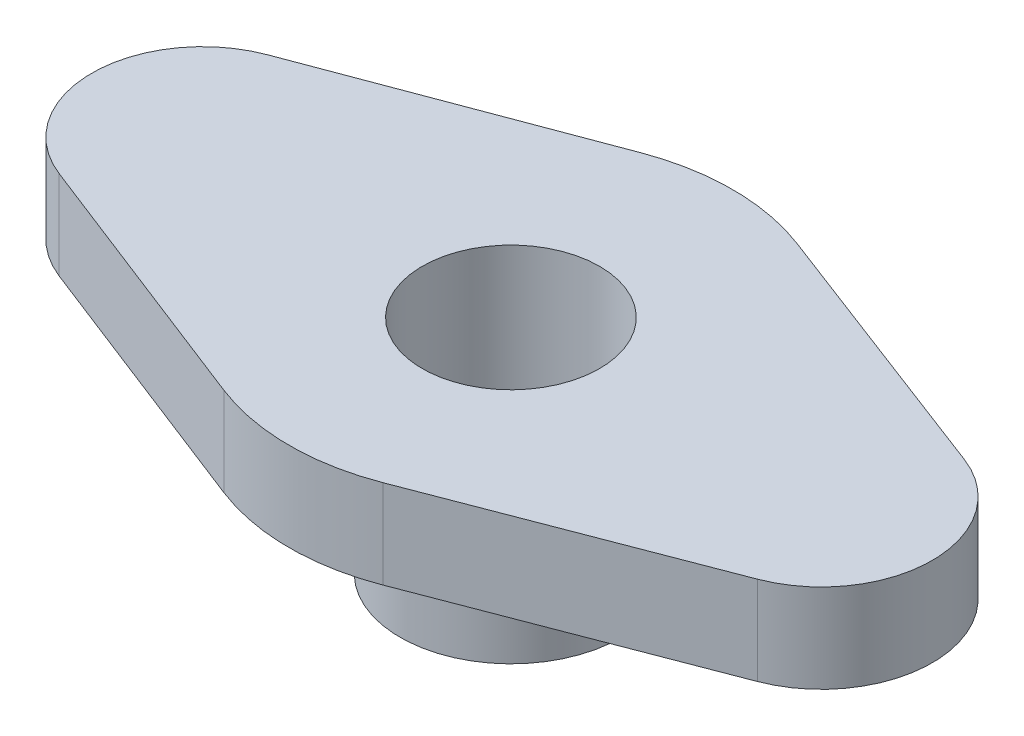
ISO-10303-21;
HEADER;
FILE_DESCRIPTION(('STEP AP214'),'2;1');
FILE_NAME('part.step','',(''),(''),'','','');
FILE_SCHEMA(('AUTOMOTIVE_DESIGN { 1 0 10303 214 1 1 1 1 }'));
ENDSEC;
DATA;
#1=APPLICATION_CONTEXT('core data for automotive mechanical design processes');
#2=APPLICATION_PROTOCOL_DEFINITION('international standard','automotive_design',2000,#1);
#3=PRODUCT_CONTEXT('',#1,'mechanical');
#4=PRODUCT('Part','Part','',(#3));
#5=PRODUCT_RELATED_PRODUCT_CATEGORY('part','',(#4));
#6=PRODUCT_DEFINITION_FORMATION('','',#4);
#7=PRODUCT_DEFINITION_CONTEXT('part definition',#1,'design');
#8=PRODUCT_DEFINITION('design','',#6,#7);
#9=PRODUCT_DEFINITION_SHAPE('','',#8);
#10=(LENGTH_UNIT() NAMED_UNIT(*) SI_UNIT(.MILLI.,.METRE.));
#11=(NAMED_UNIT(*) PLANE_ANGLE_UNIT() SI_UNIT($,.RADIAN.));
#12=(NAMED_UNIT(*) SI_UNIT($,.STERADIAN.) SOLID_ANGLE_UNIT());
#13=UNCERTAINTY_MEASURE_WITH_UNIT(LENGTH_MEASURE(1.E-05),#10,'distance_accuracy_value','');
#14=(GEOMETRIC_REPRESENTATION_CONTEXT(3) GLOBAL_UNCERTAINTY_ASSIGNED_CONTEXT((#13)) GLOBAL_UNIT_ASSIGNED_CONTEXT((#10,
#11,#12)) REPRESENTATION_CONTEXT('',''));
#15=CARTESIAN_POINT('',(0.,0.,0.));
#16=DIRECTION('',(0.,0.,1.));
#17=DIRECTION('',(1.,0.,0.));
#18=AXIS2_PLACEMENT_3D('',#15,#16,#17);
#19=CARTESIAN_POINT('',(69.9999921528156,-20.,-0.0331452222624423));
#20=DIRECTION('',(0.,1.,0.));
#21=DIRECTION('',(0.,0.,1.));
#22=AXIS2_PLACEMENT_3D('',#19,#20,#21);
#23=CYLINDRICAL_SURFACE('',#22,25.);
#24=CARTESIAN_POINT('',(69.9999921528156,0.,-0.0331452222624423));
#25=DIRECTION('',(0.,-1.,0.));
#26=DIRECTION('',(0.,0.,-1.));
#27=AXIS2_PLACEMENT_3D('',#24,#25,#26);
#28=CIRCLE('',#27,25.);
#29=CARTESIAN_POINT('',(78.9175056921311,0.,-23.3886146518441));
#30=VERTEX_POINT('',#29);
#31=CARTESIAN_POINT('',(78.9396194688102,0.,23.3138687934768));
#32=VERTEX_POINT('',#31);
#33=EDGE_CURVE('E135',#30,#32,#28,.T.);
#34=ORIENTED_EDGE('',*,*,#33,.T.);
#35=DIRECTION('',(0.,1.,0.));
#36=VECTOR('',#35,1.);
#37=CARTESIAN_POINT('',(78.9396194688102,-20.,23.3138687934768));
#38=LINE('',#37,#36);
#39=CARTESIAN_POINT('',(78.9396194688102,-20.,23.3138687934768));
#40=VERTEX_POINT('',#39);
#41=EDGE_CURVE('E40',#40,#32,#38,.T.);
#42=ORIENTED_EDGE('',*,*,#41,.F.);
#43=CARTESIAN_POINT('',(69.9999921528156,-20.,-0.0331452222624423));
#44=DIRECTION('',(0.,-1.,0.));
#45=DIRECTION('',(0.,0.,-1.));
#46=AXIS2_PLACEMENT_3D('',#43,#44,#45);
#47=CIRCLE('',#46,25.);
#48=CARTESIAN_POINT('',(78.9175056921311,-20.,-23.3886146518441));
#49=VERTEX_POINT('',#48);
#50=EDGE_CURVE('E150',#49,#40,#47,.T.);
#51=ORIENTED_EDGE('',*,*,#50,.F.);
#52=DIRECTION('',(0.,1.,0.));
#53=VECTOR('',#52,1.);
#54=CARTESIAN_POINT('',(78.9175056921311,-20.,-23.3886146518441));
#55=LINE('',#54,#53);
#56=EDGE_CURVE('E131',#49,#30,#55,.T.);
#57=ORIENTED_EDGE('',*,*,#56,.T.);
#58=EDGE_LOOP('',(#34,#42,#51,#57));
#59=FACE_BOUND('',#58,.T.);
#60=ADVANCED_FACE('F37',(#59),#23,.T.);
#61=CARTESIAN_POINT('',(17.8792546319892,-20.,46.6940280314785));
#62=DIRECTION('',(-0.357585092639783,0.,-0.933880560629569));
#63=DIRECTION('',(-0.933880560629569,0.,0.357585092639783));
#64=AXIS2_PLACEMENT_3D('',#61,#62,#63);
#65=PLANE('',#64);
#66=DIRECTION('',(-0.933880560629569,0.,0.357585092639783));
#67=VECTOR('',#66,1.);
#68=CARTESIAN_POINT('',(17.8792546319892,0.,46.6940280314785));
#69=LINE('',#68,#67);
#70=CARTESIAN_POINT('',(17.8792546319892,0.,46.6940280314785));
#71=VERTEX_POINT('',#70);
#72=EDGE_CURVE('E138',#32,#71,#69,.T.);
#73=ORIENTED_EDGE('',*,*,#72,.T.);
#74=DIRECTION('',(0.,1.,0.));
#75=VECTOR('',#74,1.);
#76=CARTESIAN_POINT('',(17.8792546319892,-20.,46.6940280314785));
#77=LINE('',#76,#75);
#78=CARTESIAN_POINT('',(17.8792546319892,-20.,46.6940280314785));
#79=VERTEX_POINT('',#78);
#80=EDGE_CURVE('E159',#79,#71,#77,.T.);
#81=ORIENTED_EDGE('',*,*,#80,.F.);
#82=DIRECTION('',(-0.933880560629569,0.,0.357585092639783));
#83=VECTOR('',#82,1.);
#84=CARTESIAN_POINT('',(17.8792546319892,-20.,46.6940280314785));
#85=LINE('',#84,#83);
#86=EDGE_CURVE('E98',#40,#79,#85,.T.);
#87=ORIENTED_EDGE('',*,*,#86,.F.);
#88=ORIENTED_EDGE('',*,*,#41,.T.);
#89=EDGE_LOOP('',(#73,#81,#87,#88));
#90=FACE_BOUND('',#89,.T.);
#91=ADVANCED_FACE('F165',(#90),#65,.F.);
#92=CARTESIAN_POINT('',(0.,-20.,0.));
#93=DIRECTION('',(0.,1.,0.));
#94=DIRECTION('',(0.,0.,1.));
#95=AXIS2_PLACEMENT_3D('',#92,#93,#94);
#96=CYLINDRICAL_SURFACE('',#95,50.);
#97=CARTESIAN_POINT('',(0.,0.,0.));
#98=DIRECTION('',(0.,-1.,0.));
#99=DIRECTION('',(0.,0.,-1.));
#100=AXIS2_PLACEMENT_3D('',#97,#98,#99);
#101=CIRCLE('',#100,50.);
#102=CARTESIAN_POINT('',(-18.1568826975564,0.,46.5867750623198));
#103=VERTEX_POINT('',#102);
#104=EDGE_CURVE('E141',#71,#103,#101,.T.);
#105=ORIENTED_EDGE('',*,*,#104,.T.);
#106=DIRECTION('',(0.,1.,0.));
#107=VECTOR('',#106,1.);
#108=CARTESIAN_POINT('',(-18.1568826975564,-20.,46.5867750623198));
#109=LINE('',#108,#107);
#110=CARTESIAN_POINT('',(-18.1568826975564,-20.,46.5867750623198));
#111=VERTEX_POINT('',#110);
#112=EDGE_CURVE('E157',#111,#103,#109,.T.);
#113=ORIENTED_EDGE('',*,*,#112,.F.);
#114=CARTESIAN_POINT('',(0.,-20.,0.));
#115=DIRECTION('',(0.,-1.,0.));
#116=DIRECTION('',(0.,0.,-1.));
#117=AXIS2_PLACEMENT_3D('',#114,#115,#116);
#118=CIRCLE('',#117,50.);
#119=EDGE_CURVE('E180',#79,#111,#118,.T.);
#120=ORIENTED_EDGE('',*,*,#119,.F.);
#121=ORIENTED_EDGE('',*,*,#80,.T.);
#122=EDGE_LOOP('',(#105,#113,#120,#121));
#123=FACE_BOUND('',#122,.T.);
#124=ADVANCED_FACE('F174',(#123),#96,.T.);
#125=CARTESIAN_POINT('',(-79.0769960781902,-20.,22.8435700198086));
#126=DIRECTION('',(0.363137653951129,0.,-0.931735501246395));
#127=DIRECTION('',(-0.931735501246395,0.,-0.363137653951129));
#128=AXIS2_PLACEMENT_3D('',#125,#126,#127);
#129=PLANE('',#128);
#130=DIRECTION('',(-0.931735501246395,0.,-0.363137653951129));
#131=VECTOR('',#130,1.);
#132=CARTESIAN_POINT('',(-79.0769960781902,0.,22.8435700198086));
#133=LINE('',#132,#131);
#134=CARTESIAN_POINT('',(-79.0769960781902,0.,22.8435700198086));
#135=VERTEX_POINT('',#134);
#136=EDGE_CURVE('E143',#103,#135,#133,.T.);
#137=ORIENTED_EDGE('',*,*,#136,.T.);
#138=DIRECTION('',(0.,1.,0.));
#139=VECTOR('',#138,1.);
#140=CARTESIAN_POINT('',(-79.0769960781902,-20.,22.8435700198086));
#141=LINE('',#140,#139);
#142=CARTESIAN_POINT('',(-79.0769960781902,-20.,22.8435700198086));
#143=VERTEX_POINT('',#142);
#144=EDGE_CURVE('E154',#143,#135,#141,.T.);
#145=ORIENTED_EDGE('',*,*,#144,.F.);
#146=DIRECTION('',(-0.931735501246395,0.,-0.363137653951129));
#147=VECTOR('',#146,1.);
#148=CARTESIAN_POINT('',(-79.0769960781902,-20.,22.8435700198086));
#149=LINE('',#148,#147);
#150=EDGE_CURVE('E179',#111,#143,#149,.T.);
#151=ORIENTED_EDGE('',*,*,#150,.F.);
#152=ORIENTED_EDGE('',*,*,#112,.T.);
#153=EDGE_LOOP('',(#137,#145,#151,#152));
#154=FACE_BOUND('',#153,.T.);
#155=ADVANCED_FACE('F177',(#154),#129,.F.);
#156=CARTESIAN_POINT('',(-69.998554729412,-20.,-0.449817511351326));
#157=DIRECTION('',(0.,1.,0.));
#158=DIRECTION('',(0.,0.,1.));
#159=AXIS2_PLACEMENT_3D('',#156,#157,#158);
#160=CYLINDRICAL_SURFACE('',#159,25.);
#161=CARTESIAN_POINT('',(-69.998554729412,0.,-0.449817511351326));
#162=DIRECTION('',(0.,-1.,0.));
#163=DIRECTION('',(0.,0.,-1.));
#164=AXIS2_PLACEMENT_3D('',#161,#162,#163);
#165=CIRCLE('',#164,25.);
#166=CARTESIAN_POINT('',(-78.7768875463001,0.,-23.8579544076518));
#167=VERTEX_POINT('',#166);
#168=EDGE_CURVE('E145',#135,#167,#165,.T.);
#169=ORIENTED_EDGE('',*,*,#168,.T.);
#170=DIRECTION('',(0.,1.,0.));
#171=VECTOR('',#170,1.);
#172=CARTESIAN_POINT('',(-78.7768875463001,-20.,-23.8579544076518));
#173=LINE('',#172,#171);
#174=CARTESIAN_POINT('',(-78.7768875463001,-20.,-23.8579544076518));
#175=VERTEX_POINT('',#174);
#176=EDGE_CURVE('E126',#175,#167,#173,.T.);
#177=ORIENTED_EDGE('',*,*,#176,.F.);
#178=CARTESIAN_POINT('',(-69.998554729412,-20.,-0.449817511351326));
#179=DIRECTION('',(0.,-1.,0.));
#180=DIRECTION('',(0.,0.,-1.));
#181=AXIS2_PLACEMENT_3D('',#178,#179,#180);
#182=CIRCLE('',#181,25.);
#183=EDGE_CURVE('E117',#143,#175,#182,.T.);
#184=ORIENTED_EDGE('',*,*,#183,.F.);
#185=ORIENTED_EDGE('',*,*,#144,.T.);
#186=EDGE_LOOP('',(#169,#177,#184,#185));
#187=FACE_BOUND('',#186,.T.);
#188=ADVANCED_FACE('F234',(#187),#160,.T.);
#189=CARTESIAN_POINT('',(-17.5566656337762,-20.,-46.816273792601));
#190=DIRECTION('',(0.351133312675524,0.,0.93632547585202));
#191=DIRECTION('',(0.93632547585202,0.,-0.351133312675524));
#192=AXIS2_PLACEMENT_3D('',#189,#190,#191);
#193=PLANE('',#192);
#194=DIRECTION('',(0.93632547585202,0.,-0.351133312675524));
#195=VECTOR('',#194,1.);
#196=CARTESIAN_POINT('',(-17.5566656337762,0.,-46.816273792601));
#197=LINE('',#196,#195);
#198=CARTESIAN_POINT('',(-17.5566656337762,0.,-46.816273792601));
#199=VERTEX_POINT('',#198);
#200=EDGE_CURVE('E125',#167,#199,#197,.T.);
#201=ORIENTED_EDGE('',*,*,#200,.T.);
#202=DIRECTION('',(0.,1.,0.));
#203=VECTOR('',#202,1.);
#204=CARTESIAN_POINT('',(-17.5566656337762,-20.,-46.816273792601));
#205=LINE('',#204,#203);
#206=CARTESIAN_POINT('',(-17.5566656337762,-20.,-46.816273792601));
#207=VERTEX_POINT('',#206);
#208=EDGE_CURVE('E122',#207,#199,#205,.T.);
#209=ORIENTED_EDGE('',*,*,#208,.F.);
#210=DIRECTION('',(0.93632547585202,0.,-0.351133312675524));
#211=VECTOR('',#210,1.);
#212=CARTESIAN_POINT('',(-17.5566656337762,-20.,-46.816273792601));
#213=LINE('',#212,#211);
#214=EDGE_CURVE('E111',#175,#207,#213,.T.);
#215=ORIENTED_EDGE('',*,*,#214,.F.);
#216=ORIENTED_EDGE('',*,*,#176,.T.);
#217=EDGE_LOOP('',(#201,#209,#215,#216));
#218=FACE_BOUND('',#217,.T.);
#219=ADVANCED_FACE('F123',(#218),#193,.F.);
#220=CARTESIAN_POINT('',(0.,-20.,0.));
#221=DIRECTION('',(0.,1.,0.));
#222=DIRECTION('',(0.,0.,1.));
#223=AXIS2_PLACEMENT_3D('',#220,#221,#222);
#224=CYLINDRICAL_SURFACE('',#223,50.);
#225=CARTESIAN_POINT('',(0.,0.,0.));
#226=DIRECTION('',(0.,-1.,0.));
#227=DIRECTION('',(0.,0.,-1.));
#228=AXIS2_PLACEMENT_3D('',#225,#226,#227);
#229=CIRCLE('',#228,50.);
#230=CARTESIAN_POINT('',(17.835027078631,0.,-46.7109388591634));
#231=VERTEX_POINT('',#230);
#232=EDGE_CURVE('E83',#199,#231,#229,.T.);
#233=ORIENTED_EDGE('',*,*,#232,.T.);
#234=DIRECTION('',(0.,1.,0.));
#235=VECTOR('',#234,1.);
#236=CARTESIAN_POINT('',(17.835027078631,-20.,-46.7109388591634));
#237=LINE('',#236,#235);
#238=CARTESIAN_POINT('',(17.835027078631,-20.,-46.7109388591634));
#239=VERTEX_POINT('',#238);
#240=EDGE_CURVE('E127',#239,#231,#237,.T.);
#241=ORIENTED_EDGE('',*,*,#240,.F.);
#242=CARTESIAN_POINT('',(0.,-20.,0.));
#243=DIRECTION('',(0.,-1.,0.));
#244=DIRECTION('',(0.,0.,-1.));
#245=AXIS2_PLACEMENT_3D('',#242,#243,#244);
#246=CIRCLE('',#245,50.);
#247=EDGE_CURVE('E115',#207,#239,#246,.T.);
#248=ORIENTED_EDGE('',*,*,#247,.F.);
#249=ORIENTED_EDGE('',*,*,#208,.T.);
#250=EDGE_LOOP('',(#233,#241,#248,#249));
#251=FACE_BOUND('',#250,.T.);
#252=ADVANCED_FACE('F129',(#251),#224,.T.);
#253=CARTESIAN_POINT('',(78.9175056921311,-20.,-23.3886146518441));
#254=DIRECTION('',(-0.35670054157262,0.,0.934218777183267));
#255=DIRECTION('',(0.934218777183267,0.,0.35670054157262));
#256=AXIS2_PLACEMENT_3D('',#253,#254,#255);
#257=PLANE('',#256);
#258=DIRECTION('',(0.934218777183267,0.,0.35670054157262));
#259=VECTOR('',#258,1.);
#260=CARTESIAN_POINT('',(78.9175056921311,0.,-23.3886146518441));
#261=LINE('',#260,#259);
#262=EDGE_CURVE('E89',#231,#30,#261,.T.);
#263=ORIENTED_EDGE('',*,*,#262,.T.);
#264=ORIENTED_EDGE('',*,*,#56,.F.);
#265=DIRECTION('',(0.934218777183267,0.,0.35670054157262));
#266=VECTOR('',#265,1.);
#267=CARTESIAN_POINT('',(78.9175056921311,-20.,-23.3886146518441));
#268=LINE('',#267,#266);
#269=EDGE_CURVE('E54',#239,#49,#268,.T.);
#270=ORIENTED_EDGE('',*,*,#269,.F.);
#271=ORIENTED_EDGE('',*,*,#240,.T.);
#272=EDGE_LOOP('',(#263,#264,#270,#271));
#273=FACE_BOUND('',#272,.T.);
#274=ADVANCED_FACE('F215',(#273),#257,.F.);
#275=CARTESIAN_POINT('',(69.9999921528156,-20.,-0.0331452222624423));
#276=DIRECTION('',(0.,-1.,0.));
#277=DIRECTION('',(0.,0.,-1.));
#278=AXIS2_PLACEMENT_3D('',#275,#276,#277);
#279=PLANE('',#278);
#280=CARTESIAN_POINT('',(0.,-20.,0.));
#281=DIRECTION('',(0.,-1.,0.));
#282=DIRECTION('',(0.,0.,-1.));
#283=AXIS2_PLACEMENT_3D('',#280,#281,#282);
#284=CIRCLE('',#283,25.);
#285=CARTESIAN_POINT('',(0.,-20.,-25.));
#286=VERTEX_POINT('',#285);
#287=EDGE_CURVE('E11',#286,#286,#284,.T.);
#288=ORIENTED_EDGE('',*,*,#287,.F.);
#289=EDGE_LOOP('',(#288));
#290=FACE_BOUND('',#289,.T.);
#291=ORIENTED_EDGE('',*,*,#50,.T.);
#292=ORIENTED_EDGE('',*,*,#86,.T.);
#293=ORIENTED_EDGE('',*,*,#119,.T.);
#294=ORIENTED_EDGE('',*,*,#150,.T.);
#295=ORIENTED_EDGE('',*,*,#183,.T.);
#296=ORIENTED_EDGE('',*,*,#214,.T.);
#297=ORIENTED_EDGE('',*,*,#247,.T.);
#298=ORIENTED_EDGE('',*,*,#269,.T.);
#299=EDGE_LOOP('',(#291,#292,#293,#294,#295,#296,#297,#298));
#300=FACE_BOUND('',#299,.T.);
#301=ADVANCED_FACE('F113',(#290,#300),#279,.T.);
#302=CARTESIAN_POINT('',(69.9999921528156,0.,-0.0331452222624423));
#303=DIRECTION('',(0.,-1.,0.));
#304=DIRECTION('',(0.,0.,-1.));
#305=AXIS2_PLACEMENT_3D('',#302,#303,#304);
#306=PLANE('',#305);
#307=CARTESIAN_POINT('',(0.,0.,0.));
#308=DIRECTION('',(0.,-1.,0.));
#309=DIRECTION('',(0.,0.,-1.));
#310=AXIS2_PLACEMENT_3D('',#307,#308,#309);
#311=CIRCLE('',#310,20.);
#312=CARTESIAN_POINT('',(0.,0.,-20.));
#313=VERTEX_POINT('',#312);
#314=EDGE_CURVE('E188',#313,#313,#311,.T.);
#315=ORIENTED_EDGE('',*,*,#314,.T.);
#316=EDGE_LOOP('',(#315));
#317=FACE_BOUND('',#316,.T.);
#318=ORIENTED_EDGE('',*,*,#33,.F.);
#319=ORIENTED_EDGE('',*,*,#262,.F.);
#320=ORIENTED_EDGE('',*,*,#232,.F.);
#321=ORIENTED_EDGE('',*,*,#200,.F.);
#322=ORIENTED_EDGE('',*,*,#168,.F.);
#323=ORIENTED_EDGE('',*,*,#136,.F.);
#324=ORIENTED_EDGE('',*,*,#104,.F.);
#325=ORIENTED_EDGE('',*,*,#72,.F.);
#326=EDGE_LOOP('',(#318,#319,#320,#321,#322,#323,#324,#325));
#327=FACE_BOUND('',#326,.T.);
#328=ADVANCED_FACE('F170',(#317,#327),#306,.F.);
#329=CARTESIAN_POINT('',(0.,-50.,0.));
#330=DIRECTION('',(0.,1.,0.));
#331=DIRECTION('',(0.,0.,1.));
#332=AXIS2_PLACEMENT_3D('',#329,#330,#331);
#333=CYLINDRICAL_SURFACE('',#332,25.);
#334=CARTESIAN_POINT('',(0.,-50.,0.));
#335=DIRECTION('',(0.,-1.,0.));
#336=DIRECTION('',(0.,0.,-1.));
#337=AXIS2_PLACEMENT_3D('',#334,#335,#336);
#338=CIRCLE('',#337,25.);
#339=CARTESIAN_POINT('',(0.,-50.,-25.));
#340=VERTEX_POINT('',#339);
#341=EDGE_CURVE('E139',#340,#340,#338,.T.);
#342=ORIENTED_EDGE('',*,*,#341,.F.);
#343=EDGE_LOOP('',(#342));
#344=FACE_BOUND('',#343,.T.);
#345=ORIENTED_EDGE('',*,*,#287,.T.);
#346=EDGE_LOOP('',(#345));
#347=FACE_BOUND('',#346,.T.);
#348=ADVANCED_FACE('F205',(#344,#347),#333,.T.);
#349=CARTESIAN_POINT('',(0.,-50.,0.));
#350=DIRECTION('',(0.,-1.,0.));
#351=DIRECTION('',(0.,0.,-1.));
#352=AXIS2_PLACEMENT_3D('',#349,#350,#351);
#353=PLANE('',#352);
#354=CARTESIAN_POINT('',(0.,-50.,0.));
#355=DIRECTION('',(0.,-1.,0.));
#356=DIRECTION('',(0.,0.,-1.));
#357=AXIS2_PLACEMENT_3D('',#354,#355,#356);
#358=CIRCLE('',#357,20.);
#359=CARTESIAN_POINT('',(0.,-50.,-20.));
#360=VERTEX_POINT('',#359);
#361=EDGE_CURVE('E189',#360,#360,#358,.T.);
#362=ORIENTED_EDGE('',*,*,#361,.F.);
#363=EDGE_LOOP('',(#362));
#364=FACE_BOUND('',#363,.T.);
#365=ORIENTED_EDGE('',*,*,#341,.T.);
#366=EDGE_LOOP('',(#365));
#367=FACE_BOUND('',#366,.T.);
#368=ADVANCED_FACE('F199',(#364,#367),#353,.T.);
#369=CARTESIAN_POINT('',(0.,0.,0.));
#370=DIRECTION('',(0.,-1.,0.));
#371=DIRECTION('',(0.,0.,-1.));
#372=AXIS2_PLACEMENT_3D('',#369,#370,#371);
#373=CYLINDRICAL_SURFACE('',#372,20.);
#374=ORIENTED_EDGE('',*,*,#314,.F.);
#375=EDGE_LOOP('',(#374));
#376=FACE_BOUND('',#375,.T.);
#377=ORIENTED_EDGE('',*,*,#361,.T.);
#378=EDGE_LOOP('',(#377));
#379=FACE_BOUND('',#378,.T.);
#380=ADVANCED_FACE('F196',(#376,#379),#373,.F.);
#381=CLOSED_SHELL('',(#60,#91,#124,#155,#188,#219,#252,#274,#301,#328,#348,#368,#380));
#382=MANIFOLD_SOLID_BREP('B2',#381);
#383=ADVANCED_BREP_SHAPE_REPRESENTATION('',(#18,#382),#14);
#384=SHAPE_DEFINITION_REPRESENTATION(#9,#383);
ENDSEC;
END-ISO-10303-21;
